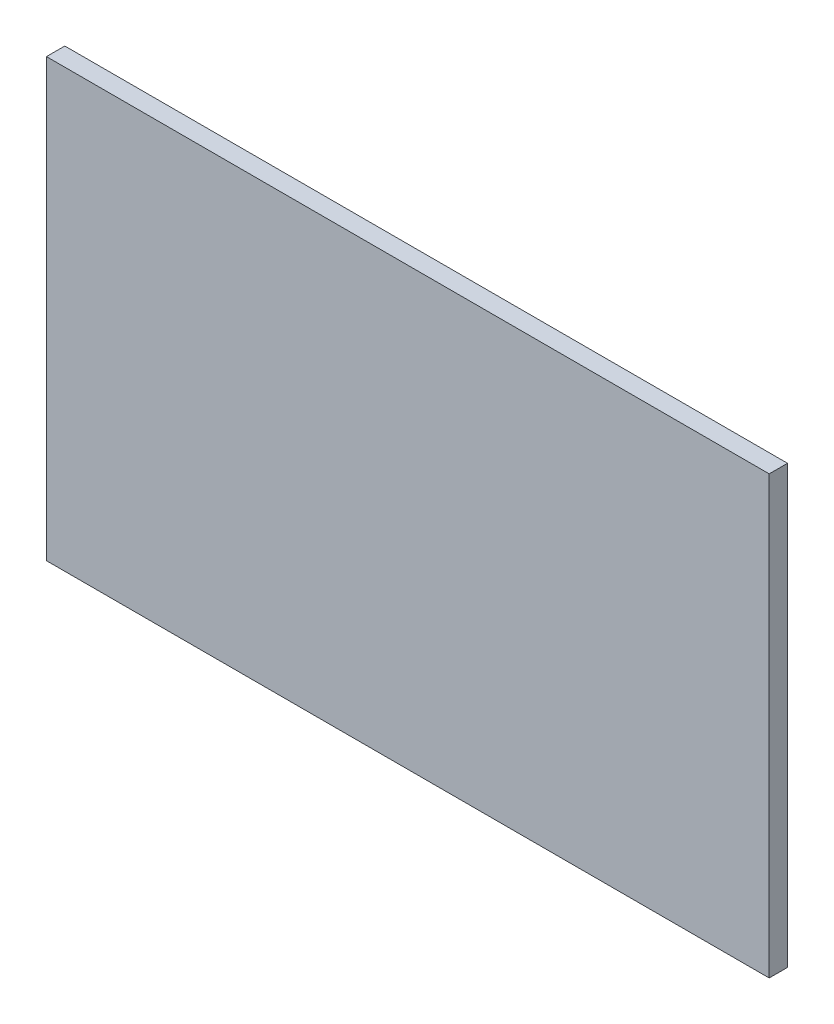
ISO-10303-21;
HEADER;
FILE_DESCRIPTION(('STEP AP214'),'2;1');
FILE_NAME('part.step','',(''),(''),'','','');
FILE_SCHEMA(('AUTOMOTIVE_DESIGN { 1 0 10303 214 1 1 1 1 }'));
ENDSEC;
DATA;
#1=APPLICATION_CONTEXT('core data for automotive mechanical design processes');
#2=APPLICATION_PROTOCOL_DEFINITION('international standard','automotive_design',2000,#1);
#3=PRODUCT_CONTEXT('',#1,'mechanical');
#4=PRODUCT('Part','Part','',(#3));
#5=PRODUCT_RELATED_PRODUCT_CATEGORY('part','',(#4));
#6=PRODUCT_DEFINITION_FORMATION('','',#4);
#7=PRODUCT_DEFINITION_CONTEXT('part definition',#1,'design');
#8=PRODUCT_DEFINITION('design','',#6,#7);
#9=PRODUCT_DEFINITION_SHAPE('','',#8);
#10=(LENGTH_UNIT() NAMED_UNIT(*) SI_UNIT(.MILLI.,.METRE.));
#11=(NAMED_UNIT(*) PLANE_ANGLE_UNIT() SI_UNIT($,.RADIAN.));
#12=(NAMED_UNIT(*) SI_UNIT($,.STERADIAN.) SOLID_ANGLE_UNIT());
#13=UNCERTAINTY_MEASURE_WITH_UNIT(LENGTH_MEASURE(1.E-05),#10,'distance_accuracy_value','');
#14=(GEOMETRIC_REPRESENTATION_CONTEXT(3) GLOBAL_UNCERTAINTY_ASSIGNED_CONTEXT((#13)) GLOBAL_UNIT_ASSIGNED_CONTEXT((#10,
#11,#12)) REPRESENTATION_CONTEXT('',''));
#15=CARTESIAN_POINT('',(0.,0.,0.));
#16=DIRECTION('',(0.,0.,1.));
#17=DIRECTION('',(1.,0.,0.));
#18=AXIS2_PLACEMENT_3D('',#15,#16,#17);
#19=CARTESIAN_POINT('',(0.,0.,1000.));
#20=DIRECTION('',(0.,0.,1.));
#21=DIRECTION('',(1.,0.,0.));
#22=AXIS2_PLACEMENT_3D('',#19,#20,#21);
#23=PLANE('',#22);
#24=DIRECTION('',(1.,0.,0.));
#25=VECTOR('',#24,1.);
#26=CARTESIAN_POINT('',(1270.65927287539,-4483.,1000.));
#27=LINE('',#26,#25);
#28=CARTESIAN_POINT('',(1090.65927287539,-4483.,1000.));
#29=VERTEX_POINT('',#28);
#30=CARTESIAN_POINT('',(1270.65927287539,-4483.,1000.));
#31=VERTEX_POINT('',#30);
#32=EDGE_CURVE('E196',#29,#31,#27,.T.);
#33=ORIENTED_EDGE('',*,*,#32,.T.);
#34=DIRECTION('',(0.,1.,0.));
#35=VECTOR('',#34,1.);
#36=CARTESIAN_POINT('',(1270.65927287539,-4483.,1000.));
#37=LINE('',#36,#35);
#38=CARTESIAN_POINT('',(1270.65927287539,-3883.,1000.));
#39=VERTEX_POINT('',#38);
#40=EDGE_CURVE('E186',#31,#39,#37,.T.);
#41=ORIENTED_EDGE('',*,*,#40,.T.);
#42=DIRECTION('',(-1.,0.,0.));
#43=VECTOR('',#42,1.);
#44=CARTESIAN_POINT('',(1270.65927287539,-3883.,1000.));
#45=LINE('',#44,#43);
#46=CARTESIAN_POINT('',(1090.65927287539,-3883.,1000.));
#47=VERTEX_POINT('',#46);
#48=EDGE_CURVE('E189',#39,#47,#45,.T.);
#49=ORIENTED_EDGE('',*,*,#48,.T.);
#50=DIRECTION('',(0.,-1.,0.));
#51=VECTOR('',#50,1.);
#52=CARTESIAN_POINT('',(1090.65927287539,-4483.,1000.));
#53=LINE('',#52,#51);
#54=EDGE_CURVE('E193',#47,#29,#53,.T.);
#55=ORIENTED_EDGE('',*,*,#54,.T.);
#56=EDGE_LOOP('',(#33,#41,#49,#55));
#57=FACE_BOUND('',#56,.T.);
#58=DIRECTION('',(0.,-1.,0.));
#59=VECTOR('',#58,1.);
#60=CARTESIAN_POINT('',(-4393.96112474474,-6563.47980040857,1000.));
#61=LINE('',#60,#59);
#62=CARTESIAN_POINT('',(-4393.96112474474,-1802.52019959143,1000.));
#63=VERTEX_POINT('',#62);
#64=CARTESIAN_POINT('',(-4393.96112474474,-6563.47980040857,1000.));
#65=VERTEX_POINT('',#64);
#66=EDGE_CURVE('E155',#63,#65,#61,.T.);
#67=ORIENTED_EDGE('',*,*,#66,.F.);
#68=DIRECTION('',(-1.,0.,0.));
#69=VECTOR('',#68,1.);
#70=CARTESIAN_POINT('',(3487.1300980124,-1802.52019959143,1000.));
#71=LINE('',#70,#69);
#72=CARTESIAN_POINT('',(3487.1300980124,-1802.52019959143,1000.));
#73=VERTEX_POINT('',#72);
#74=EDGE_CURVE('E160',#73,#63,#71,.T.);
#75=ORIENTED_EDGE('',*,*,#74,.F.);
#76=DIRECTION('',(0.,1.,0.));
#77=VECTOR('',#76,1.);
#78=CARTESIAN_POINT('',(3487.1300980124,-6563.47980040857,1000.));
#79=LINE('',#78,#77);
#80=CARTESIAN_POINT('',(3487.1300980124,-6563.47980040857,1000.));
#81=VERTEX_POINT('',#80);
#82=EDGE_CURVE('E171',#81,#73,#79,.T.);
#83=ORIENTED_EDGE('',*,*,#82,.F.);
#84=DIRECTION('',(1.,0.,0.));
#85=VECTOR('',#84,1.);
#86=CARTESIAN_POINT('',(3487.1300980124,-6563.47980040857,1000.));
#87=LINE('',#86,#85);
#88=EDGE_CURVE('E169',#65,#81,#87,.T.);
#89=ORIENTED_EDGE('',*,*,#88,.F.);
#90=EDGE_LOOP('',(#67,#75,#83,#89));
#91=FACE_BOUND('',#90,.T.);
#92=DIRECTION('',(0.,1.,0.));
#93=VECTOR('',#92,1.);
#94=CARTESIAN_POINT('',(-169.340727124608,-4483.,1000.));
#95=LINE('',#94,#93);
#96=CARTESIAN_POINT('',(-169.340727124608,-4483.,1000.));
#97=VERTEX_POINT('',#96);
#98=CARTESIAN_POINT('',(-169.340727124608,-3883.,1000.));
#99=VERTEX_POINT('',#98);
#100=EDGE_CURVE('E49',#97,#99,#95,.T.);
#101=ORIENTED_EDGE('',*,*,#100,.T.);
#102=DIRECTION('',(-1.,0.,0.));
#103=VECTOR('',#102,1.);
#104=CARTESIAN_POINT('',(-169.340727124608,-3883.,1000.));
#105=LINE('',#104,#103);
#106=CARTESIAN_POINT('',(-349.340727124608,-3883.,1000.));
#107=VERTEX_POINT('',#106);
#108=EDGE_CURVE('E53',#99,#107,#105,.T.);
#109=ORIENTED_EDGE('',*,*,#108,.T.);
#110=DIRECTION('',(0.,-1.,0.));
#111=VECTOR('',#110,1.);
#112=CARTESIAN_POINT('',(-349.340727124608,-4483.,1000.));
#113=LINE('',#112,#111);
#114=CARTESIAN_POINT('',(-349.340727124608,-4483.,1000.));
#115=VERTEX_POINT('',#114);
#116=EDGE_CURVE('E119',#107,#115,#113,.T.);
#117=ORIENTED_EDGE('',*,*,#116,.T.);
#118=DIRECTION('',(1.,0.,0.));
#119=VECTOR('',#118,1.);
#120=CARTESIAN_POINT('',(-169.340727124608,-4483.,1000.));
#121=LINE('',#120,#119);
#122=EDGE_CURVE('E122',#115,#97,#121,.T.);
#123=ORIENTED_EDGE('',*,*,#122,.T.);
#124=EDGE_LOOP('',(#101,#109,#117,#123));
#125=FACE_BOUND('',#124,.T.);
#126=ADVANCED_FACE('F34',(#57,#91,#125),#23,.F.);
#127=CARTESIAN_POINT('',(1270.65927287539,-4483.,1000.));
#128=DIRECTION('',(-1.,0.,0.));
#129=DIRECTION('',(0.,0.,1.));
#130=AXIS2_PLACEMENT_3D('',#127,#128,#129);
#131=PLANE('',#130);
#132=DIRECTION('',(0.,1.,0.));
#133=VECTOR('',#132,1.);
#134=CARTESIAN_POINT('',(1270.65927287539,-4483.,0.));
#135=LINE('',#134,#133);
#136=CARTESIAN_POINT('',(1270.65927287539,-4483.,0.));
#137=VERTEX_POINT('',#136);
#138=CARTESIAN_POINT('',(1270.65927287539,-3883.,0.));
#139=VERTEX_POINT('',#138);
#140=EDGE_CURVE('E185',#137,#139,#135,.T.);
#141=ORIENTED_EDGE('',*,*,#140,.T.);
#142=DIRECTION('',(0.,0.,-1.));
#143=VECTOR('',#142,1.);
#144=CARTESIAN_POINT('',(1270.65927287539,-3883.,1000.));
#145=LINE('',#144,#143);
#146=EDGE_CURVE('E11',#39,#139,#145,.T.);
#147=ORIENTED_EDGE('',*,*,#146,.F.);
#148=ORIENTED_EDGE('',*,*,#40,.F.);
#149=DIRECTION('',(0.,0.,-1.));
#150=VECTOR('',#149,1.);
#151=CARTESIAN_POINT('',(1270.65927287539,-4483.,1000.));
#152=LINE('',#151,#150);
#153=EDGE_CURVE('E199',#31,#137,#152,.T.);
#154=ORIENTED_EDGE('',*,*,#153,.T.);
#155=EDGE_LOOP('',(#141,#147,#148,#154));
#156=FACE_BOUND('',#155,.T.);
#157=ADVANCED_FACE('F36',(#156),#131,.F.);
#158=CARTESIAN_POINT('',(1270.65927287539,-3883.,1000.));
#159=DIRECTION('',(0.,-1.,0.));
#160=DIRECTION('',(0.,0.,-1.));
#161=AXIS2_PLACEMENT_3D('',#158,#159,#160);
#162=PLANE('',#161);
#163=DIRECTION('',(-1.,0.,0.));
#164=VECTOR('',#163,1.);
#165=CARTESIAN_POINT('',(1270.65927287539,-3883.,0.));
#166=LINE('',#165,#164);
#167=CARTESIAN_POINT('',(1090.65927287539,-3883.,0.));
#168=VERTEX_POINT('',#167);
#169=EDGE_CURVE('E202',#139,#168,#166,.T.);
#170=ORIENTED_EDGE('',*,*,#169,.T.);
#171=DIRECTION('',(0.,0.,-1.));
#172=VECTOR('',#171,1.);
#173=CARTESIAN_POINT('',(1090.65927287539,-3883.,1000.));
#174=LINE('',#173,#172);
#175=EDGE_CURVE('E42',#47,#168,#174,.T.);
#176=ORIENTED_EDGE('',*,*,#175,.F.);
#177=ORIENTED_EDGE('',*,*,#48,.F.);
#178=ORIENTED_EDGE('',*,*,#146,.T.);
#179=EDGE_LOOP('',(#170,#176,#177,#178));
#180=FACE_BOUND('',#179,.T.);
#181=ADVANCED_FACE('F229',(#180),#162,.F.);
#182=CARTESIAN_POINT('',(1090.65927287539,-4483.,1000.));
#183=DIRECTION('',(1.,0.,0.));
#184=DIRECTION('',(0.,0.,-1.));
#185=AXIS2_PLACEMENT_3D('',#182,#183,#184);
#186=PLANE('',#185);
#187=DIRECTION('',(0.,-1.,0.));
#188=VECTOR('',#187,1.);
#189=CARTESIAN_POINT('',(1090.65927287539,-4483.,0.));
#190=LINE('',#189,#188);
#191=CARTESIAN_POINT('',(1090.65927287539,-4483.,0.));
#192=VERTEX_POINT('',#191);
#193=EDGE_CURVE('E204',#168,#192,#190,.T.);
#194=ORIENTED_EDGE('',*,*,#193,.T.);
#195=DIRECTION('',(0.,0.,-1.));
#196=VECTOR('',#195,1.);
#197=CARTESIAN_POINT('',(1090.65927287539,-4483.,1000.));
#198=LINE('',#197,#196);
#199=EDGE_CURVE('E209',#29,#192,#198,.T.);
#200=ORIENTED_EDGE('',*,*,#199,.F.);
#201=ORIENTED_EDGE('',*,*,#54,.F.);
#202=ORIENTED_EDGE('',*,*,#175,.T.);
#203=EDGE_LOOP('',(#194,#200,#201,#202));
#204=FACE_BOUND('',#203,.T.);
#205=ADVANCED_FACE('F215',(#204),#186,.F.);
#206=CARTESIAN_POINT('',(1270.65927287539,-4483.,1000.));
#207=DIRECTION('',(0.,1.,0.));
#208=DIRECTION('',(0.,0.,1.));
#209=AXIS2_PLACEMENT_3D('',#206,#207,#208);
#210=PLANE('',#209);
#211=DIRECTION('',(1.,0.,0.));
#212=VECTOR('',#211,1.);
#213=CARTESIAN_POINT('',(1270.65927287539,-4483.,0.));
#214=LINE('',#213,#212);
#215=EDGE_CURVE('E190',#192,#137,#214,.T.);
#216=ORIENTED_EDGE('',*,*,#215,.T.);
#217=ORIENTED_EDGE('',*,*,#153,.F.);
#218=ORIENTED_EDGE('',*,*,#32,.F.);
#219=ORIENTED_EDGE('',*,*,#199,.T.);
#220=EDGE_LOOP('',(#216,#217,#218,#219));
#221=FACE_BOUND('',#220,.T.);
#222=ADVANCED_FACE('F223',(#221),#210,.F.);
#223=CARTESIAN_POINT('',(0.,0.,0.));
#224=DIRECTION('',(0.,0.,1.));
#225=DIRECTION('',(1.,0.,0.));
#226=AXIS2_PLACEMENT_3D('',#223,#224,#225);
#227=PLANE('',#226);
#228=ORIENTED_EDGE('',*,*,#140,.F.);
#229=ORIENTED_EDGE('',*,*,#215,.F.);
#230=ORIENTED_EDGE('',*,*,#193,.F.);
#231=ORIENTED_EDGE('',*,*,#169,.F.);
#232=EDGE_LOOP('',(#228,#229,#230,#231));
#233=FACE_BOUND('',#232,.T.);
#234=ADVANCED_FACE('F220',(#233),#227,.F.);
#235=CARTESIAN_POINT('',(-4393.96112474474,-6563.47980040857,1200.));
#236=DIRECTION('',(1.,0.,0.));
#237=DIRECTION('',(0.,0.,-1.));
#238=AXIS2_PLACEMENT_3D('',#235,#236,#237);
#239=PLANE('',#238);
#240=ORIENTED_EDGE('',*,*,#66,.T.);
#241=DIRECTION('',(0.,0.,-1.));
#242=VECTOR('',#241,1.);
#243=CARTESIAN_POINT('',(-4393.96112474474,-6563.47980040857,1200.));
#244=LINE('',#243,#242);
#245=CARTESIAN_POINT('',(-4393.96112474474,-6563.47980040857,1200.));
#246=VERTEX_POINT('',#245);
#247=EDGE_CURVE('E182',#246,#65,#244,.T.);
#248=ORIENTED_EDGE('',*,*,#247,.F.);
#249=DIRECTION('',(0.,-1.,0.));
#250=VECTOR('',#249,1.);
#251=CARTESIAN_POINT('',(-4393.96112474474,-6563.47980040857,1200.));
#252=LINE('',#251,#250);
#253=CARTESIAN_POINT('',(-4393.96112474474,-1802.52019959143,1200.));
#254=VERTEX_POINT('',#253);
#255=EDGE_CURVE('E156',#254,#246,#252,.T.);
#256=ORIENTED_EDGE('',*,*,#255,.F.);
#257=DIRECTION('',(0.,0.,-1.));
#258=VECTOR('',#257,1.);
#259=CARTESIAN_POINT('',(-4393.96112474474,-1802.52019959143,1200.));
#260=LINE('',#259,#258);
#261=EDGE_CURVE('E166',#254,#63,#260,.T.);
#262=ORIENTED_EDGE('',*,*,#261,.T.);
#263=EDGE_LOOP('',(#240,#248,#256,#262));
#264=FACE_BOUND('',#263,.T.);
#265=ADVANCED_FACE('F255',(#264),#239,.F.);
#266=CARTESIAN_POINT('',(3487.1300980124,-6563.47980040857,1200.));
#267=DIRECTION('',(0.,1.,0.));
#268=DIRECTION('',(0.,0.,1.));
#269=AXIS2_PLACEMENT_3D('',#266,#267,#268);
#270=PLANE('',#269);
#271=ORIENTED_EDGE('',*,*,#88,.T.);
#272=DIRECTION('',(0.,0.,-1.));
#273=VECTOR('',#272,1.);
#274=CARTESIAN_POINT('',(3487.1300980124,-6563.47980040857,1200.));
#275=LINE('',#274,#273);
#276=CARTESIAN_POINT('',(3487.1300980124,-6563.47980040857,1200.));
#277=VERTEX_POINT('',#276);
#278=EDGE_CURVE('E179',#277,#81,#275,.T.);
#279=ORIENTED_EDGE('',*,*,#278,.F.);
#280=DIRECTION('',(1.,0.,0.));
#281=VECTOR('',#280,1.);
#282=CARTESIAN_POINT('',(3487.1300980124,-6563.47980040857,1200.));
#283=LINE('',#282,#281);
#284=EDGE_CURVE('E159',#246,#277,#283,.T.);
#285=ORIENTED_EDGE('',*,*,#284,.F.);
#286=ORIENTED_EDGE('',*,*,#247,.T.);
#287=EDGE_LOOP('',(#271,#279,#285,#286));
#288=FACE_BOUND('',#287,.T.);
#289=ADVANCED_FACE('F251',(#288),#270,.F.);
#290=CARTESIAN_POINT('',(3487.1300980124,-6563.47980040857,1200.));
#291=DIRECTION('',(-1.,0.,0.));
#292=DIRECTION('',(0.,0.,1.));
#293=AXIS2_PLACEMENT_3D('',#290,#291,#292);
#294=PLANE('',#293);
#295=ORIENTED_EDGE('',*,*,#82,.T.);
#296=DIRECTION('',(0.,0.,-1.));
#297=VECTOR('',#296,1.);
#298=CARTESIAN_POINT('',(3487.1300980124,-1802.52019959143,1200.));
#299=LINE('',#298,#297);
#300=CARTESIAN_POINT('',(3487.1300980124,-1802.52019959143,1200.));
#301=VERTEX_POINT('',#300);
#302=EDGE_CURVE('E176',#301,#73,#299,.T.);
#303=ORIENTED_EDGE('',*,*,#302,.F.);
#304=DIRECTION('',(0.,1.,0.));
#305=VECTOR('',#304,1.);
#306=CARTESIAN_POINT('',(3487.1300980124,-6563.47980040857,1200.));
#307=LINE('',#306,#305);
#308=EDGE_CURVE('E162',#277,#301,#307,.T.);
#309=ORIENTED_EDGE('',*,*,#308,.F.);
#310=ORIENTED_EDGE('',*,*,#278,.T.);
#311=EDGE_LOOP('',(#295,#303,#309,#310));
#312=FACE_BOUND('',#311,.T.);
#313=ADVANCED_FACE('F247',(#312),#294,.F.);
#314=CARTESIAN_POINT('',(3487.1300980124,-1802.52019959143,1200.));
#315=DIRECTION('',(0.,-1.,0.));
#316=DIRECTION('',(1.,0.,0.));
#317=AXIS2_PLACEMENT_3D('',#314,#315,#316);
#318=PLANE('',#317);
#319=ORIENTED_EDGE('',*,*,#74,.T.);
#320=ORIENTED_EDGE('',*,*,#261,.F.);
#321=DIRECTION('',(-1.,0.,0.));
#322=VECTOR('',#321,1.);
#323=CARTESIAN_POINT('',(3487.1300980124,-1802.52019959143,1200.));
#324=LINE('',#323,#322);
#325=EDGE_CURVE('E164',#301,#254,#324,.T.);
#326=ORIENTED_EDGE('',*,*,#325,.F.);
#327=ORIENTED_EDGE('',*,*,#302,.T.);
#328=EDGE_LOOP('',(#319,#320,#326,#327));
#329=FACE_BOUND('',#328,.T.);
#330=ADVANCED_FACE('F244',(#329),#318,.F.);
#331=CARTESIAN_POINT('',(0.,0.,1200.));
#332=DIRECTION('',(0.,0.,1.));
#333=DIRECTION('',(1.,0.,0.));
#334=AXIS2_PLACEMENT_3D('',#331,#332,#333);
#335=PLANE('',#334);
#336=ORIENTED_EDGE('',*,*,#255,.T.);
#337=ORIENTED_EDGE('',*,*,#284,.T.);
#338=ORIENTED_EDGE('',*,*,#308,.T.);
#339=ORIENTED_EDGE('',*,*,#325,.T.);
#340=EDGE_LOOP('',(#336,#337,#338,#339));
#341=FACE_BOUND('',#340,.T.);
#342=ADVANCED_FACE('F242',(#341),#335,.T.);
#343=CARTESIAN_POINT('',(-169.340727124608,-4483.,1000.));
#344=DIRECTION('',(-1.,0.,0.));
#345=DIRECTION('',(0.,0.,1.));
#346=AXIS2_PLACEMENT_3D('',#343,#344,#345);
#347=PLANE('',#346);
#348=DIRECTION('',(0.,1.,0.));
#349=VECTOR('',#348,1.);
#350=CARTESIAN_POINT('',(-169.340727124608,-4483.,0.));
#351=LINE('',#350,#349);
#352=CARTESIAN_POINT('',(-169.340727124608,-4483.,0.));
#353=VERTEX_POINT('',#352);
#354=CARTESIAN_POINT('',(-169.340727124608,-3883.,0.));
#355=VERTEX_POINT('',#354);
#356=EDGE_CURVE('E143',#353,#355,#351,.T.);
#357=ORIENTED_EDGE('',*,*,#356,.T.);
#358=DIRECTION('',(0.,0.,-1.));
#359=VECTOR('',#358,1.);
#360=CARTESIAN_POINT('',(-169.340727124608,-3883.,1000.));
#361=LINE('',#360,#359);
#362=EDGE_CURVE('E152',#99,#355,#361,.T.);
#363=ORIENTED_EDGE('',*,*,#362,.F.);
#364=ORIENTED_EDGE('',*,*,#100,.F.);
#365=DIRECTION('',(0.,0.,-1.));
#366=VECTOR('',#365,1.);
#367=CARTESIAN_POINT('',(-169.340727124608,-4483.,1000.));
#368=LINE('',#367,#366);
#369=EDGE_CURVE('E135',#97,#353,#368,.T.);
#370=ORIENTED_EDGE('',*,*,#369,.T.);
#371=EDGE_LOOP('',(#357,#363,#364,#370));
#372=FACE_BOUND('',#371,.T.);
#373=ADVANCED_FACE('F293',(#372),#347,.F.);
#374=CARTESIAN_POINT('',(-169.340727124608,-3883.,1000.));
#375=DIRECTION('',(0.,-1.,0.));
#376=DIRECTION('',(0.,0.,-1.));
#377=AXIS2_PLACEMENT_3D('',#374,#375,#376);
#378=PLANE('',#377);
#379=DIRECTION('',(-1.,0.,0.));
#380=VECTOR('',#379,1.);
#381=CARTESIAN_POINT('',(-169.340727124608,-3883.,0.));
#382=LINE('',#381,#380);
#383=CARTESIAN_POINT('',(-349.340727124608,-3883.,0.));
#384=VERTEX_POINT('',#383);
#385=EDGE_CURVE('E146',#355,#384,#382,.T.);
#386=ORIENTED_EDGE('',*,*,#385,.T.);
#387=DIRECTION('',(0.,0.,-1.));
#388=VECTOR('',#387,1.);
#389=CARTESIAN_POINT('',(-349.340727124608,-3883.,1000.));
#390=LINE('',#389,#388);
#391=EDGE_CURVE('E134',#107,#384,#390,.T.);
#392=ORIENTED_EDGE('',*,*,#391,.F.);
#393=ORIENTED_EDGE('',*,*,#108,.F.);
#394=ORIENTED_EDGE('',*,*,#362,.T.);
#395=EDGE_LOOP('',(#386,#392,#393,#394));
#396=FACE_BOUND('',#395,.T.);
#397=ADVANCED_FACE('F300',(#396),#378,.F.);
#398=CARTESIAN_POINT('',(-349.340727124608,-4483.,1000.));
#399=DIRECTION('',(1.,0.,0.));
#400=DIRECTION('',(0.,0.,-1.));
#401=AXIS2_PLACEMENT_3D('',#398,#399,#400);
#402=PLANE('',#401);
#403=DIRECTION('',(0.,-1.,0.));
#404=VECTOR('',#403,1.);
#405=CARTESIAN_POINT('',(-349.340727124608,-4483.,0.));
#406=LINE('',#405,#404);
#407=CARTESIAN_POINT('',(-349.340727124608,-4483.,0.));
#408=VERTEX_POINT('',#407);
#409=EDGE_CURVE('E131',#384,#408,#406,.T.);
#410=ORIENTED_EDGE('',*,*,#409,.T.);
#411=DIRECTION('',(0.,0.,-1.));
#412=VECTOR('',#411,1.);
#413=CARTESIAN_POINT('',(-349.340727124608,-4483.,1000.));
#414=LINE('',#413,#412);
#415=EDGE_CURVE('E128',#115,#408,#414,.T.);
#416=ORIENTED_EDGE('',*,*,#415,.F.);
#417=ORIENTED_EDGE('',*,*,#116,.F.);
#418=ORIENTED_EDGE('',*,*,#391,.T.);
#419=EDGE_LOOP('',(#410,#416,#417,#418));
#420=FACE_BOUND('',#419,.T.);
#421=ADVANCED_FACE('F129',(#420),#402,.F.);
#422=CARTESIAN_POINT('',(-169.340727124608,-4483.,1000.));
#423=DIRECTION('',(0.,1.,0.));
#424=DIRECTION('',(0.,0.,1.));
#425=AXIS2_PLACEMENT_3D('',#422,#423,#424);
#426=PLANE('',#425);
#427=DIRECTION('',(1.,0.,0.));
#428=VECTOR('',#427,1.);
#429=CARTESIAN_POINT('',(-169.340727124608,-4483.,0.));
#430=LINE('',#429,#428);
#431=EDGE_CURVE('E149',#408,#353,#430,.T.);
#432=ORIENTED_EDGE('',*,*,#431,.T.);
#433=ORIENTED_EDGE('',*,*,#369,.F.);
#434=ORIENTED_EDGE('',*,*,#122,.F.);
#435=ORIENTED_EDGE('',*,*,#415,.T.);
#436=EDGE_LOOP('',(#432,#433,#434,#435));
#437=FACE_BOUND('',#436,.T.);
#438=ADVANCED_FACE('F137',(#437),#426,.F.);
#439=CARTESIAN_POINT('',(0.,0.,0.));
#440=DIRECTION('',(0.,0.,1.));
#441=DIRECTION('',(1.,0.,0.));
#442=AXIS2_PLACEMENT_3D('',#439,#440,#441);
#443=PLANE('',#442);
#444=ORIENTED_EDGE('',*,*,#356,.F.);
#445=ORIENTED_EDGE('',*,*,#431,.F.);
#446=ORIENTED_EDGE('',*,*,#409,.F.);
#447=ORIENTED_EDGE('',*,*,#385,.F.);
#448=EDGE_LOOP('',(#444,#445,#446,#447));
#449=FACE_BOUND('',#448,.T.);
#450=ADVANCED_FACE('F320',(#449),#443,.F.);
#451=CLOSED_SHELL('',(#126,#157,#181,#205,#222,#234,#265,#289,#313,#330,#342,#373,#397,#421,
#438,#450));
#452=MANIFOLD_SOLID_BREP('B2',#451);
#453=ADVANCED_BREP_SHAPE_REPRESENTATION('',(#18,#452),#14);
#454=SHAPE_DEFINITION_REPRESENTATION(#9,#453);
ENDSEC;
END-ISO-10303-21;
